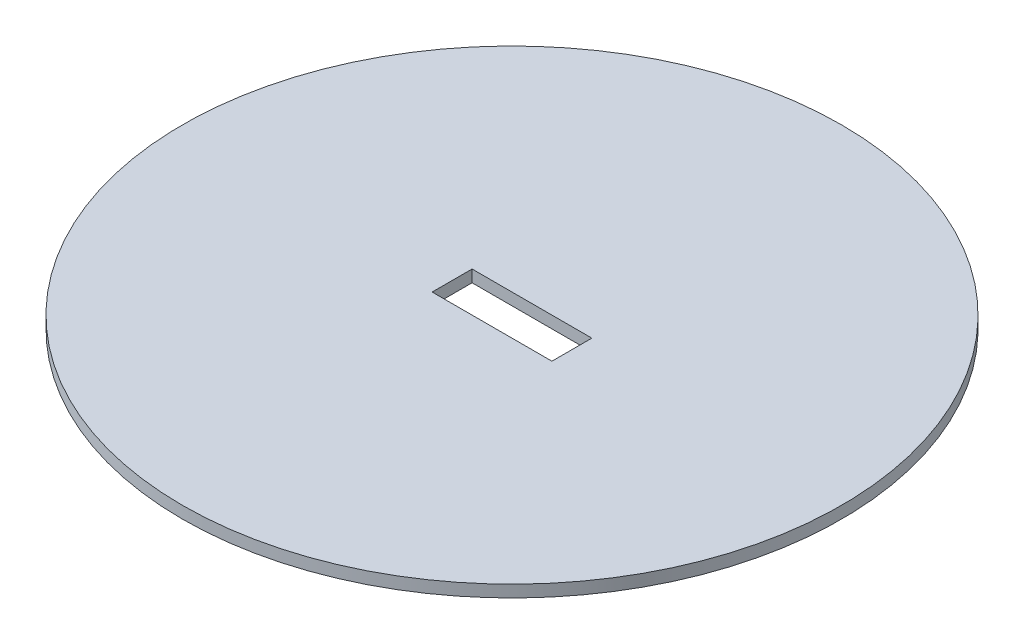
ISO-10303-21;
HEADER;
FILE_DESCRIPTION(('STEP AP214'),'2;1');
FILE_NAME('part.step','',(''),(''),'','','');
FILE_SCHEMA(('AUTOMOTIVE_DESIGN { 1 0 10303 214 1 1 1 1 }'));
ENDSEC;
DATA;
#1=APPLICATION_CONTEXT('core data for automotive mechanical design processes');
#2=APPLICATION_PROTOCOL_DEFINITION('international standard','automotive_design',2000,#1);
#3=PRODUCT_CONTEXT('',#1,'mechanical');
#4=PRODUCT('Part','Part','',(#3));
#5=PRODUCT_RELATED_PRODUCT_CATEGORY('part','',(#4));
#6=PRODUCT_DEFINITION_FORMATION('','',#4);
#7=PRODUCT_DEFINITION_CONTEXT('part definition',#1,'design');
#8=PRODUCT_DEFINITION('design','',#6,#7);
#9=PRODUCT_DEFINITION_SHAPE('','',#8);
#10=(LENGTH_UNIT() NAMED_UNIT(*) SI_UNIT(.MILLI.,.METRE.));
#11=(NAMED_UNIT(*) PLANE_ANGLE_UNIT() SI_UNIT($,.RADIAN.));
#12=(NAMED_UNIT(*) SI_UNIT($,.STERADIAN.) SOLID_ANGLE_UNIT());
#13=UNCERTAINTY_MEASURE_WITH_UNIT(LENGTH_MEASURE(1.E-05),#10,'distance_accuracy_value','');
#14=(GEOMETRIC_REPRESENTATION_CONTEXT(3) GLOBAL_UNCERTAINTY_ASSIGNED_CONTEXT((#13)) GLOBAL_UNIT_ASSIGNED_CONTEXT((#10,
#11,#12)) REPRESENTATION_CONTEXT('',''));
#15=CARTESIAN_POINT('',(0.,0.,0.));
#16=DIRECTION('',(0.,0.,1.));
#17=DIRECTION('',(1.,0.,0.));
#18=AXIS2_PLACEMENT_3D('',#15,#16,#17);
#19=CARTESIAN_POINT('',(0.,3.,0.));
#20=DIRECTION('',(0.,-1.,0.));
#21=DIRECTION('',(0.,0.,-1.));
#22=AXIS2_PLACEMENT_3D('',#19,#20,#21);
#23=CYLINDRICAL_SURFACE('',#22,82.55);
#24=CARTESIAN_POINT('',(0.,3.,0.));
#25=DIRECTION('',(0.,1.,0.));
#26=DIRECTION('',(0.,0.,1.));
#27=AXIS2_PLACEMENT_3D('',#24,#25,#26);
#28=CIRCLE('',#27,82.55);
#29=CARTESIAN_POINT('',(0.,3.,82.55));
#30=VERTEX_POINT('',#29);
#31=EDGE_CURVE('E101',#30,#30,#28,.T.);
#32=ORIENTED_EDGE('',*,*,#31,.F.);
#33=EDGE_LOOP('',(#32));
#34=FACE_BOUND('',#33,.T.);
#35=CARTESIAN_POINT('',(0.,0.,0.));
#36=DIRECTION('',(0.,1.,0.));
#37=DIRECTION('',(0.,0.,1.));
#38=AXIS2_PLACEMENT_3D('',#35,#36,#37);
#39=CIRCLE('',#38,82.55);
#40=CARTESIAN_POINT('',(0.,0.,82.55));
#41=VERTEX_POINT('',#40);
#42=EDGE_CURVE('E98',#41,#41,#39,.T.);
#43=ORIENTED_EDGE('',*,*,#42,.T.);
#44=EDGE_LOOP('',(#43));
#45=FACE_BOUND('',#44,.T.);
#46=ADVANCED_FACE('F32',(#34,#45),#23,.T.);
#47=CARTESIAN_POINT('',(0.,3.,0.));
#48=DIRECTION('',(0.,1.,0.));
#49=DIRECTION('',(0.,0.,1.));
#50=AXIS2_PLACEMENT_3D('',#47,#48,#49);
#51=PLANE('',#50);
#52=DIRECTION('',(0.,0.,-1.));
#53=VECTOR('',#52,1.);
#54=CARTESIAN_POINT('',(15.,3.,-5.));
#55=LINE('',#54,#53);
#56=CARTESIAN_POINT('',(15.,3.,5.));
#57=VERTEX_POINT('',#56);
#58=CARTESIAN_POINT('',(15.,3.,-5.));
#59=VERTEX_POINT('',#58);
#60=EDGE_CURVE('E46',#57,#59,#55,.T.);
#61=ORIENTED_EDGE('',*,*,#60,.F.);
#62=DIRECTION('',(1.,0.,0.));
#63=VECTOR('',#62,1.);
#64=CARTESIAN_POINT('',(-15.,3.,5.));
#65=LINE('',#64,#63);
#66=CARTESIAN_POINT('',(-15.,3.,5.));
#67=VERTEX_POINT('',#66);
#68=EDGE_CURVE('E91',#67,#57,#65,.T.);
#69=ORIENTED_EDGE('',*,*,#68,.F.);
#70=DIRECTION('',(0.,0.,1.));
#71=VECTOR('',#70,1.);
#72=CARTESIAN_POINT('',(-15.,3.,-5.));
#73=LINE('',#72,#71);
#74=CARTESIAN_POINT('',(-15.,3.,-5.));
#75=VERTEX_POINT('',#74);
#76=EDGE_CURVE('E75',#75,#67,#73,.T.);
#77=ORIENTED_EDGE('',*,*,#76,.F.);
#78=DIRECTION('',(-1.,0.,0.));
#79=VECTOR('',#78,1.);
#80=CARTESIAN_POINT('',(-15.,3.,-5.));
#81=LINE('',#80,#79);
#82=EDGE_CURVE('E84',#59,#75,#81,.T.);
#83=ORIENTED_EDGE('',*,*,#82,.F.);
#84=EDGE_LOOP('',(#61,#69,#77,#83));
#85=FACE_BOUND('',#84,.T.);
#86=ORIENTED_EDGE('',*,*,#31,.T.);
#87=EDGE_LOOP('',(#86));
#88=FACE_BOUND('',#87,.T.);
#89=ADVANCED_FACE('F88',(#85,#88),#51,.T.);
#90=CARTESIAN_POINT('',(0.,0.,0.));
#91=DIRECTION('',(0.,1.,0.));
#92=DIRECTION('',(0.,0.,1.));
#93=AXIS2_PLACEMENT_3D('',#90,#91,#92);
#94=PLANE('',#93);
#95=DIRECTION('',(1.,0.,0.));
#96=VECTOR('',#95,1.);
#97=CARTESIAN_POINT('',(0.,0.,5.));
#98=LINE('',#97,#96);
#99=CARTESIAN_POINT('',(-15.,0.,5.));
#100=VERTEX_POINT('',#99);
#101=CARTESIAN_POINT('',(15.,0.,5.));
#102=VERTEX_POINT('',#101);
#103=EDGE_CURVE('E39',#100,#102,#98,.T.);
#104=ORIENTED_EDGE('',*,*,#103,.T.);
#105=DIRECTION('',(0.,0.,-1.));
#106=VECTOR('',#105,1.);
#107=CARTESIAN_POINT('',(15.,0.,0.));
#108=LINE('',#107,#106);
#109=CARTESIAN_POINT('',(15.,0.,-5.));
#110=VERTEX_POINT('',#109);
#111=EDGE_CURVE('E11',#102,#110,#108,.T.);
#112=ORIENTED_EDGE('',*,*,#111,.T.);
#113=DIRECTION('',(-1.,0.,0.));
#114=VECTOR('',#113,1.);
#115=CARTESIAN_POINT('',(0.,0.,-5.));
#116=LINE('',#115,#114);
#117=CARTESIAN_POINT('',(-15.,0.,-5.));
#118=VERTEX_POINT('',#117);
#119=EDGE_CURVE('E104',#110,#118,#116,.T.);
#120=ORIENTED_EDGE('',*,*,#119,.T.);
#121=DIRECTION('',(0.,0.,1.));
#122=VECTOR('',#121,1.);
#123=CARTESIAN_POINT('',(-15.,0.,0.));
#124=LINE('',#123,#122);
#125=EDGE_CURVE('E78',#118,#100,#124,.T.);
#126=ORIENTED_EDGE('',*,*,#125,.T.);
#127=EDGE_LOOP('',(#104,#112,#120,#126));
#128=FACE_BOUND('',#127,.T.);
#129=ORIENTED_EDGE('',*,*,#42,.F.);
#130=EDGE_LOOP('',(#129));
#131=FACE_BOUND('',#130,.T.);
#132=ADVANCED_FACE('F110',(#128,#131),#94,.F.);
#133=CARTESIAN_POINT('',(15.,-10.,-5.));
#134=DIRECTION('',(1.,0.,0.));
#135=DIRECTION('',(0.,0.,-1.));
#136=AXIS2_PLACEMENT_3D('',#133,#134,#135);
#137=PLANE('',#136);
#138=DIRECTION('',(0.,1.,0.));
#139=VECTOR('',#138,1.);
#140=CARTESIAN_POINT('',(15.,-10.,5.));
#141=LINE('',#140,#139);
#142=EDGE_CURVE('E96',#102,#57,#141,.T.);
#143=ORIENTED_EDGE('',*,*,#142,.T.);
#144=ORIENTED_EDGE('',*,*,#60,.T.);
#145=DIRECTION('',(0.,1.,0.));
#146=VECTOR('',#145,1.);
#147=CARTESIAN_POINT('',(15.,-10.,-5.));
#148=LINE('',#147,#146);
#149=EDGE_CURVE('E81',#110,#59,#148,.T.);
#150=ORIENTED_EDGE('',*,*,#149,.F.);
#151=ORIENTED_EDGE('',*,*,#111,.F.);
#152=EDGE_LOOP('',(#143,#144,#150,#151));
#153=FACE_BOUND('',#152,.T.);
#154=ADVANCED_FACE('F115',(#153),#137,.F.);
#155=CARTESIAN_POINT('',(-15.,-10.,5.));
#156=DIRECTION('',(0.,0.,1.));
#157=DIRECTION('',(1.,0.,0.));
#158=AXIS2_PLACEMENT_3D('',#155,#156,#157);
#159=PLANE('',#158);
#160=DIRECTION('',(0.,1.,0.));
#161=VECTOR('',#160,1.);
#162=CARTESIAN_POINT('',(-15.,-10.,5.));
#163=LINE('',#162,#161);
#164=EDGE_CURVE('E80',#100,#67,#163,.T.);
#165=ORIENTED_EDGE('',*,*,#164,.T.);
#166=ORIENTED_EDGE('',*,*,#68,.T.);
#167=ORIENTED_EDGE('',*,*,#142,.F.);
#168=ORIENTED_EDGE('',*,*,#103,.F.);
#169=EDGE_LOOP('',(#165,#166,#167,#168));
#170=FACE_BOUND('',#169,.T.);
#171=ADVANCED_FACE('F114',(#170),#159,.F.);
#172=CARTESIAN_POINT('',(-15.,-10.,-5.));
#173=DIRECTION('',(-1.,0.,0.));
#174=DIRECTION('',(0.,0.,1.));
#175=AXIS2_PLACEMENT_3D('',#172,#173,#174);
#176=PLANE('',#175);
#177=DIRECTION('',(0.,1.,0.));
#178=VECTOR('',#177,1.);
#179=CARTESIAN_POINT('',(-15.,-10.,-5.));
#180=LINE('',#179,#178);
#181=EDGE_CURVE('E54',#118,#75,#180,.T.);
#182=ORIENTED_EDGE('',*,*,#181,.T.);
#183=ORIENTED_EDGE('',*,*,#76,.T.);
#184=ORIENTED_EDGE('',*,*,#164,.F.);
#185=ORIENTED_EDGE('',*,*,#125,.F.);
#186=EDGE_LOOP('',(#182,#183,#184,#185));
#187=FACE_BOUND('',#186,.T.);
#188=ADVANCED_FACE('F72',(#187),#176,.F.);
#189=CARTESIAN_POINT('',(-15.,-10.,-5.));
#190=DIRECTION('',(0.,0.,-1.));
#191=DIRECTION('',(-1.,0.,0.));
#192=AXIS2_PLACEMENT_3D('',#189,#190,#191);
#193=PLANE('',#192);
#194=ORIENTED_EDGE('',*,*,#149,.T.);
#195=ORIENTED_EDGE('',*,*,#82,.T.);
#196=ORIENTED_EDGE('',*,*,#181,.F.);
#197=ORIENTED_EDGE('',*,*,#119,.F.);
#198=EDGE_LOOP('',(#194,#195,#196,#197));
#199=FACE_BOUND('',#198,.T.);
#200=ADVANCED_FACE('F85',(#199),#193,.F.);
#201=CLOSED_SHELL('',(#46,#89,#132,#154,#171,#188,#200));
#202=MANIFOLD_SOLID_BREP('B2',#201);
#203=ADVANCED_BREP_SHAPE_REPRESENTATION('',(#18,#202),#14);
#204=SHAPE_DEFINITION_REPRESENTATION(#9,#203);
ENDSEC;
END-ISO-10303-21;
